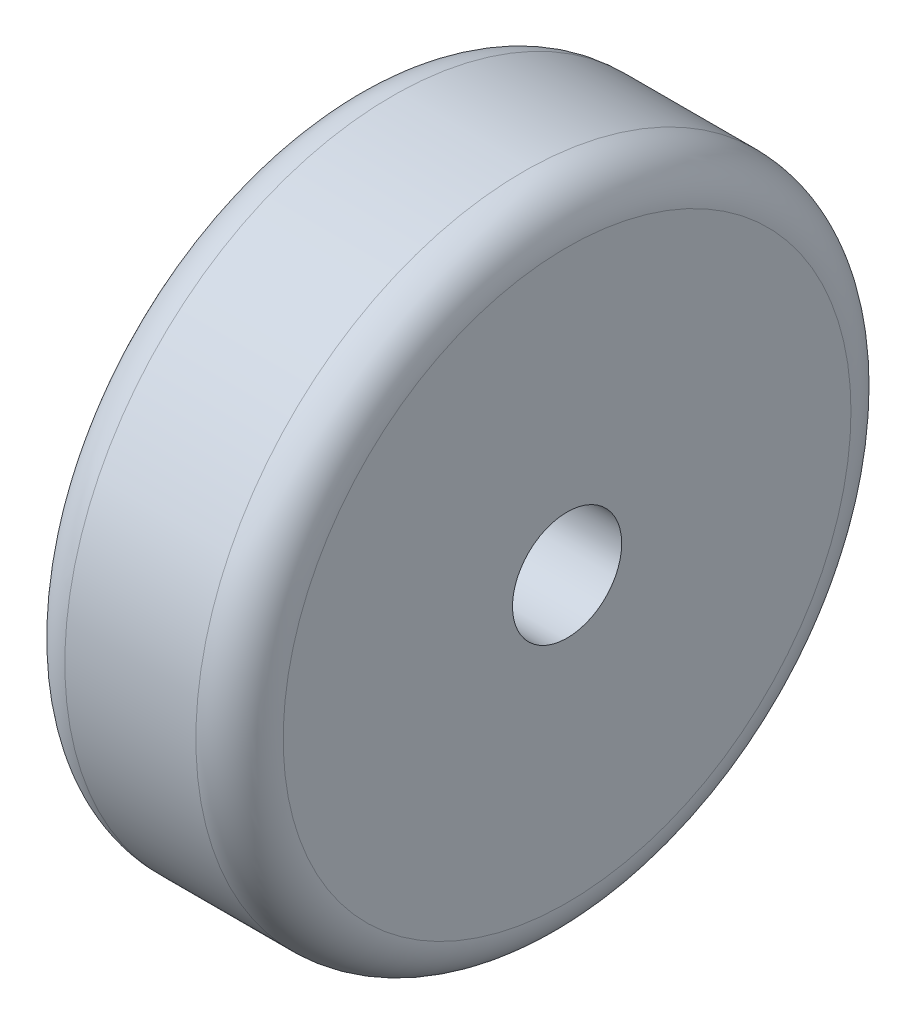
ISO-10303-21;
HEADER;
FILE_DESCRIPTION(('STEP AP214'),'2;1');
FILE_NAME('part.step','',(''),(''),'','','');
FILE_SCHEMA(('AUTOMOTIVE_DESIGN { 1 0 10303 214 1 1 1 1 }'));
ENDSEC;
DATA;
#1=APPLICATION_CONTEXT('core data for automotive mechanical design processes');
#2=APPLICATION_PROTOCOL_DEFINITION('international standard','automotive_design',2000,#1);
#3=PRODUCT_CONTEXT('',#1,'mechanical');
#4=PRODUCT('Part','Part','',(#3));
#5=PRODUCT_RELATED_PRODUCT_CATEGORY('part','',(#4));
#6=PRODUCT_DEFINITION_FORMATION('','',#4);
#7=PRODUCT_DEFINITION_CONTEXT('part definition',#1,'design');
#8=PRODUCT_DEFINITION('design','',#6,#7);
#9=PRODUCT_DEFINITION_SHAPE('','',#8);
#10=(LENGTH_UNIT() NAMED_UNIT(*) SI_UNIT(.MILLI.,.METRE.));
#11=(NAMED_UNIT(*) PLANE_ANGLE_UNIT() SI_UNIT($,.RADIAN.));
#12=(NAMED_UNIT(*) SI_UNIT($,.STERADIAN.) SOLID_ANGLE_UNIT());
#13=UNCERTAINTY_MEASURE_WITH_UNIT(LENGTH_MEASURE(1.E-05),#10,'distance_accuracy_value','');
#14=(GEOMETRIC_REPRESENTATION_CONTEXT(3) GLOBAL_UNCERTAINTY_ASSIGNED_CONTEXT((#13)) GLOBAL_UNIT_ASSIGNED_CONTEXT((#10,
#11,#12)) REPRESENTATION_CONTEXT('',''));
#15=CARTESIAN_POINT('',(0.,0.,0.));
#16=DIRECTION('',(0.,0.,1.));
#17=DIRECTION('',(1.,0.,0.));
#18=AXIS2_PLACEMENT_3D('',#15,#16,#17);
#19=CARTESIAN_POINT('',(25.4,0.,0.));
#20=DIRECTION('',(1.,0.,0.));
#21=DIRECTION('',(0.,0.,-1.));
#22=AXIS2_PLACEMENT_3D('',#19,#20,#21);
#23=PLANE('',#22);
#24=CARTESIAN_POINT('',(25.4,0.,0.));
#25=DIRECTION('',(1.,0.,0.));
#26=DIRECTION('',(0.,0.,-1.));
#27=AXIS2_PLACEMENT_3D('',#24,#25,#26);
#28=CIRCLE('',#27,33.02);
#29=CARTESIAN_POINT('',(25.4,0.,-33.02));
#30=VERTEX_POINT('',#29);
#31=EDGE_CURVE('E10',#30,#30,#28,.T.);
#32=ORIENTED_EDGE('',*,*,#31,.T.);
#33=EDGE_LOOP('',(#32));
#34=FACE_BOUND('',#33,.T.);
#35=CARTESIAN_POINT('',(25.4,0.,0.));
#36=DIRECTION('',(1.,0.,0.));
#37=DIRECTION('',(0.,0.,-1.));
#38=AXIS2_PLACEMENT_3D('',#35,#36,#37);
#39=CIRCLE('',#38,6.35);
#40=CARTESIAN_POINT('',(25.4,0.,-6.35));
#41=VERTEX_POINT('',#40);
#42=EDGE_CURVE('E54',#41,#41,#39,.T.);
#43=ORIENTED_EDGE('',*,*,#42,.F.);
#44=EDGE_LOOP('',(#43));
#45=FACE_BOUND('',#44,.T.);
#46=ADVANCED_FACE('F34',(#34,#45),#23,.T.);
#47=CARTESIAN_POINT('',(0.,0.,0.));
#48=DIRECTION('',(1.,0.,0.));
#49=DIRECTION('',(0.,0.,-1.));
#50=AXIS2_PLACEMENT_3D('',#47,#48,#49);
#51=PLANE('',#50);
#52=CARTESIAN_POINT('',(0.,0.,0.));
#53=DIRECTION('',(1.,0.,0.));
#54=DIRECTION('',(0.,0.,-1.));
#55=AXIS2_PLACEMENT_3D('',#52,#53,#54);
#56=CIRCLE('',#55,33.02);
#57=CARTESIAN_POINT('',(0.,0.,-33.02));
#58=VERTEX_POINT('',#57);
#59=EDGE_CURVE('E41',#58,#58,#56,.F.);
#60=ORIENTED_EDGE('',*,*,#59,.T.);
#61=EDGE_LOOP('',(#60));
#62=FACE_BOUND('',#61,.T.);
#63=CARTESIAN_POINT('',(0.,0.,0.));
#64=DIRECTION('',(1.,0.,0.));
#65=DIRECTION('',(0.,0.,-1.));
#66=AXIS2_PLACEMENT_3D('',#63,#64,#65);
#67=CIRCLE('',#66,6.35);
#68=CARTESIAN_POINT('',(0.,0.,-6.35));
#69=VERTEX_POINT('',#68);
#70=EDGE_CURVE('E55',#69,#69,#67,.T.);
#71=ORIENTED_EDGE('',*,*,#70,.T.);
#72=EDGE_LOOP('',(#71));
#73=FACE_BOUND('',#72,.T.);
#74=ADVANCED_FACE('F65',(#62,#73),#51,.F.);
#75=CARTESIAN_POINT('',(25.4,0.,0.));
#76=DIRECTION('',(-1.,0.,0.));
#77=DIRECTION('',(0.,0.,1.));
#78=AXIS2_PLACEMENT_3D('',#75,#76,#77);
#79=CYLINDRICAL_SURFACE('',#78,38.1);
#80=CARTESIAN_POINT('',(5.08,0.,0.));
#81=DIRECTION('',(1.,0.,0.));
#82=DIRECTION('',(0.,0.,-1.));
#83=AXIS2_PLACEMENT_3D('',#80,#81,#82);
#84=CIRCLE('',#83,38.1);
#85=CARTESIAN_POINT('',(5.08,0.,-38.1));
#86=VERTEX_POINT('',#85);
#87=EDGE_CURVE('E45',#86,#86,#84,.T.);
#88=ORIENTED_EDGE('',*,*,#87,.T.);
#89=EDGE_LOOP('',(#88));
#90=FACE_BOUND('',#89,.T.);
#91=CARTESIAN_POINT('',(20.32,0.,0.));
#92=DIRECTION('',(1.,0.,0.));
#93=DIRECTION('',(0.,0.,-1.));
#94=AXIS2_PLACEMENT_3D('',#91,#92,#93);
#95=CIRCLE('',#94,38.1);
#96=CARTESIAN_POINT('',(20.32,0.,-38.1));
#97=VERTEX_POINT('',#96);
#98=EDGE_CURVE('E49',#97,#97,#95,.F.);
#99=ORIENTED_EDGE('',*,*,#98,.T.);
#100=EDGE_LOOP('',(#99));
#101=FACE_BOUND('',#100,.T.);
#102=ADVANCED_FACE('F70',(#90,#101),#79,.T.);
#103=CARTESIAN_POINT('',(25.4,0.,0.));
#104=DIRECTION('',(-1.,0.,0.));
#105=DIRECTION('',(0.,0.,1.));
#106=AXIS2_PLACEMENT_3D('',#103,#104,#105);
#107=CYLINDRICAL_SURFACE('',#106,6.35);
#108=ORIENTED_EDGE('',*,*,#42,.T.);
#109=EDGE_LOOP('',(#108));
#110=FACE_BOUND('',#109,.T.);
#111=ORIENTED_EDGE('',*,*,#70,.F.);
#112=EDGE_LOOP('',(#111));
#113=FACE_BOUND('',#112,.T.);
#114=ADVANCED_FACE('F61',(#110,#113),#107,.F.);
#115=CARTESIAN_POINT('',(5.08,0.,0.));
#116=DIRECTION('',(1.,0.,0.));
#117=DIRECTION('',(0.,0.,-1.));
#118=AXIS2_PLACEMENT_3D('',#115,#116,#117);
#119=TOROIDAL_SURFACE('',#118,33.02,5.08);
#120=ORIENTED_EDGE('',*,*,#59,.F.);
#121=EDGE_LOOP('',(#120));
#122=FACE_BOUND('',#121,.T.);
#123=ORIENTED_EDGE('',*,*,#87,.F.);
#124=EDGE_LOOP('',(#123));
#125=FACE_BOUND('',#124,.T.);
#126=ADVANCED_FACE('F76',(#122,#125),#119,.T.);
#127=CARTESIAN_POINT('',(20.32,0.,0.));
#128=DIRECTION('',(1.,0.,0.));
#129=DIRECTION('',(0.,0.,-1.));
#130=AXIS2_PLACEMENT_3D('',#127,#128,#129);
#131=TOROIDAL_SURFACE('',#130,33.02,5.08);
#132=ORIENTED_EDGE('',*,*,#98,.F.);
#133=EDGE_LOOP('',(#132));
#134=FACE_BOUND('',#133,.T.);
#135=ORIENTED_EDGE('',*,*,#31,.F.);
#136=EDGE_LOOP('',(#135));
#137=FACE_BOUND('',#136,.T.);
#138=ADVANCED_FACE('F36',(#134,#137),#131,.T.);
#139=CLOSED_SHELL('',(#46,#74,#102,#114,#126,#138));
#140=MANIFOLD_SOLID_BREP('B2',#139);
#141=ADVANCED_BREP_SHAPE_REPRESENTATION('',(#18,#140),#14);
#142=SHAPE_DEFINITION_REPRESENTATION(#9,#141);
ENDSEC;
END-ISO-10303-21;
